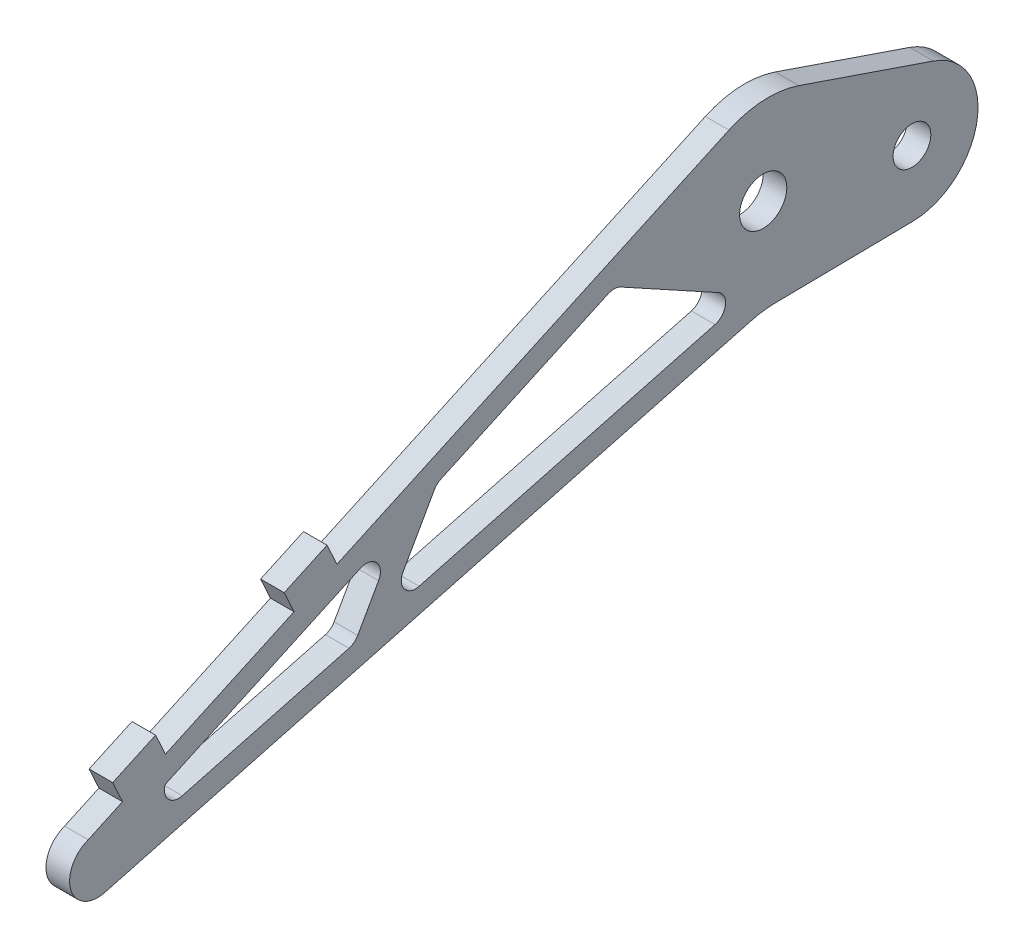
ISO-10303-21;
HEADER;
FILE_DESCRIPTION(('STEP AP214'),'2;1');
FILE_NAME('part.step','',(''),(''),'','','');
FILE_SCHEMA(('AUTOMOTIVE_DESIGN { 1 0 10303 214 1 1 1 1 }'));
ENDSEC;
DATA;
#1=APPLICATION_CONTEXT('core data for automotive mechanical design processes');
#2=APPLICATION_PROTOCOL_DEFINITION('international standard','automotive_design',2000,#1);
#3=PRODUCT_CONTEXT('',#1,'mechanical');
#4=PRODUCT('Part','Part','',(#3));
#5=PRODUCT_RELATED_PRODUCT_CATEGORY('part','',(#4));
#6=PRODUCT_DEFINITION_FORMATION('','',#4);
#7=PRODUCT_DEFINITION_CONTEXT('part definition',#1,'design');
#8=PRODUCT_DEFINITION('design','',#6,#7);
#9=PRODUCT_DEFINITION_SHAPE('','',#8);
#10=(LENGTH_UNIT() NAMED_UNIT(*) SI_UNIT(.MILLI.,.METRE.));
#11=(NAMED_UNIT(*) PLANE_ANGLE_UNIT() SI_UNIT($,.RADIAN.));
#12=(NAMED_UNIT(*) SI_UNIT($,.STERADIAN.) SOLID_ANGLE_UNIT());
#13=UNCERTAINTY_MEASURE_WITH_UNIT(LENGTH_MEASURE(1.E-05),#10,'distance_accuracy_value','');
#14=(GEOMETRIC_REPRESENTATION_CONTEXT(3) GLOBAL_UNCERTAINTY_ASSIGNED_CONTEXT((#13)) GLOBAL_UNIT_ASSIGNED_CONTEXT((#10,
#11,#12)) REPRESENTATION_CONTEXT('',''));
#15=CARTESIAN_POINT('',(0.,0.,0.));
#16=DIRECTION('',(0.,0.,1.));
#17=DIRECTION('',(1.,0.,0.));
#18=AXIS2_PLACEMENT_3D('',#15,#16,#17);
#19=CARTESIAN_POINT('',(-5.,42.7149862762416,75.7582726885151));
#20=DIRECTION('',(0.,-0.491142804434341,-0.871079069690215));
#21=DIRECTION('',(0.,0.871079069690215,-0.491142804434341));
#22=AXIS2_PLACEMENT_3D('',#19,#20,#21);
#23=PLANE('',#22);
#24=DIRECTION('',(0.,0.871079069690215,-0.491142804434341));
#25=VECTOR('',#24,1.);
#26=CARTESIAN_POINT('',(-5.,42.7149862762416,75.7582726885151));
#27=LINE('',#26,#25);
#28=CARTESIAN_POINT('',(-5.,-31.1814140846215,117.423474590042));
#29=VERTEX_POINT('',#28);
#30=CARTESIAN_POINT('',(-5.,-23.336162533829,113.00006576044));
#31=VERTEX_POINT('',#30);
#32=EDGE_CURVE('E325',#29,#31,#27,.T.);
#33=ORIENTED_EDGE('',*,*,#32,.F.);
#34=DIRECTION('',(1.,0.,0.));
#35=VECTOR('',#34,1.);
#36=CARTESIAN_POINT('',(0.,-31.1814140846215,117.423474590042));
#37=LINE('',#36,#35);
#38=CARTESIAN_POINT('',(0.,-31.1814140846215,117.423474590042));
#39=VERTEX_POINT('',#38);
#40=EDGE_CURVE('E434',#29,#39,#37,.T.);
#41=ORIENTED_EDGE('',*,*,#40,.T.);
#42=DIRECTION('',(0.,0.871079069690215,-0.491142804434341));
#43=VECTOR('',#42,1.);
#44=CARTESIAN_POINT('',(0.,42.7149862762416,75.7582726885151));
#45=LINE('',#44,#43);
#46=CARTESIAN_POINT('',(0.,-23.336162533829,113.00006576044));
#47=VERTEX_POINT('',#46);
#48=EDGE_CURVE('E383',#39,#47,#45,.T.);
#49=ORIENTED_EDGE('',*,*,#48,.T.);
#50=DIRECTION('',(1.,0.,0.));
#51=VECTOR('',#50,1.);
#52=CARTESIAN_POINT('',(-5.,-23.336162533829,113.00006576044));
#53=LINE('',#52,#51);
#54=EDGE_CURVE('E432',#47,#31,#53,.F.);
#55=ORIENTED_EDGE('',*,*,#54,.T.);
#56=EDGE_LOOP('',(#33,#41,#49,#55));
#57=FACE_BOUND('',#56,.T.);
#58=ADVANCED_FACE('F41',(#57),#23,.F.);
#59=CARTESIAN_POINT('',(-5.,28.5133908564941,13.0926520590053));
#60=DIRECTION('',(0.,0.908774699277071,0.417287126513471));
#61=DIRECTION('',(0.,-0.417287126513471,0.908774699277071));
#62=AXIS2_PLACEMENT_3D('',#59,#60,#61);
#63=PLANE('',#62);
#64=DIRECTION('',(0.,-0.417287126513471,0.908774699277071));
#65=VECTOR('',#64,1.);
#66=CARTESIAN_POINT('',(0.,28.5133908564941,13.0926520590053));
#67=LINE('',#66,#65);
#68=CARTESIAN_POINT('',(0.,-19.1364100226948,116.865164349051));
#69=VERTEX_POINT('',#68);
#70=CARTESIAN_POINT('',(0.,-37.8751570505175,157.674712770356));
#71=VERTEX_POINT('',#70);
#72=EDGE_CURVE('E274',#69,#71,#67,.T.);
#73=ORIENTED_EDGE('',*,*,#72,.T.);
#74=DIRECTION('',(1.,0.,0.));
#75=VECTOR('',#74,1.);
#76=CARTESIAN_POINT('',(-5.,-37.8751570505175,157.674712770356));
#77=LINE('',#76,#75);
#78=CARTESIAN_POINT('',(-5.,-37.8751570505175,157.674712770356));
#79=VERTEX_POINT('',#78);
#80=EDGE_CURVE('E429',#71,#79,#77,.F.);
#81=ORIENTED_EDGE('',*,*,#80,.T.);
#82=DIRECTION('',(0.,-0.417287126513471,0.908774699277071));
#83=VECTOR('',#82,1.);
#84=CARTESIAN_POINT('',(-5.,28.5133908564941,13.0926520590053));
#85=LINE('',#84,#83);
#86=CARTESIAN_POINT('',(-5.,-19.1364100226948,116.865164349051));
#87=VERTEX_POINT('',#86);
#88=EDGE_CURVE('E269',#87,#79,#85,.T.);
#89=ORIENTED_EDGE('',*,*,#88,.F.);
#90=DIRECTION('',(1.,0.,0.));
#91=VECTOR('',#90,1.);
#92=CARTESIAN_POINT('',(0.,-19.1364100226947,116.865164349051));
#93=LINE('',#92,#91);
#94=EDGE_CURVE('E426',#87,#69,#93,.T.);
#95=ORIENTED_EDGE('',*,*,#94,.T.);
#96=EDGE_LOOP('',(#73,#81,#89,#95));
#97=FACE_BOUND('',#96,.T.);
#98=ADVANCED_FACE('F495',(#97),#63,.F.);
#99=CARTESIAN_POINT('',(-5.,-22.2783526460679,12.2362606081096));
#100=DIRECTION('',(0.,0.876495415777774,-0.481410205667212));
#101=DIRECTION('',(0.,0.481410205667212,0.876495415777774));
#102=AXIS2_PLACEMENT_3D('',#99,#100,#101);
#103=PLANE('',#102);
#104=DIRECTION('',(0.,0.481410205667212,0.876495415777774));
#105=VECTOR('',#104,1.);
#106=CARTESIAN_POINT('',(-5.,-22.2783526460679,12.2362606081096));
#107=LINE('',#106,#105);
#108=CARTESIAN_POINT('',(-5.,-6.45483735528322,41.0458671569366));
#109=VERTEX_POINT('',#108);
#110=CARTESIAN_POINT('',(-5.,4.87295604040297,61.6701889210253));
#111=VERTEX_POINT('',#110);
#112=EDGE_CURVE('E313',#109,#111,#107,.T.);
#113=ORIENTED_EDGE('',*,*,#112,.F.);
#114=DIRECTION('',(1.,0.,0.));
#115=VECTOR('',#114,1.);
#116=CARTESIAN_POINT('',(0.,-6.45483735528322,41.0458671569366));
#117=LINE('',#116,#115);
#118=CARTESIAN_POINT('',(0.,-6.45483735528322,41.0458671569366));
#119=VERTEX_POINT('',#118);
#120=EDGE_CURVE('E458',#109,#119,#117,.T.);
#121=ORIENTED_EDGE('',*,*,#120,.T.);
#122=DIRECTION('',(0.,0.481410205667212,0.876495415777774));
#123=VECTOR('',#122,1.);
#124=CARTESIAN_POINT('',(0.,-22.2783526460679,12.2362606081096));
#125=LINE('',#124,#123);
#126=CARTESIAN_POINT('',(0.,4.87295604040297,61.6701889210253));
#127=VERTEX_POINT('',#126);
#128=EDGE_CURVE('E371',#119,#127,#125,.T.);
#129=ORIENTED_EDGE('',*,*,#128,.T.);
#130=DIRECTION('',(1.,0.,0.));
#131=VECTOR('',#130,1.);
#132=CARTESIAN_POINT('',(-5.,4.87295604040297,61.6701889210253));
#133=LINE('',#132,#131);
#134=EDGE_CURVE('E456',#127,#111,#133,.F.);
#135=ORIENTED_EDGE('',*,*,#134,.T.);
#136=EDGE_LOOP('',(#113,#121,#129,#135));
#137=FACE_BOUND('',#136,.T.);
#138=ADVANCED_FACE('F533',(#137),#103,.F.);
#139=CARTESIAN_POINT('',(-5.,28.5133908564941,13.0926520590053));
#140=DIRECTION('',(0.,0.908774699277071,0.417287126513471));
#141=DIRECTION('',(0.,-0.417287126513471,0.908774699277071));
#142=AXIS2_PLACEMENT_3D('',#139,#140,#141);
#143=PLANE('',#142);
#144=DIRECTION('',(0.,-0.417287126513471,0.908774699277071));
#145=VECTOR('',#144,1.);
#146=CARTESIAN_POINT('',(0.,28.5133908564941,13.0926520590053));
#147=LINE('',#146,#145);
#148=CARTESIAN_POINT('',(0.,4.96979389090087,64.3662809175674));
#149=VERTEX_POINT('',#148);
#150=CARTESIAN_POINT('',(0.,-11.3122815133787,99.8256498723704));
#151=VERTEX_POINT('',#150);
#152=EDGE_CURVE('E380',#149,#151,#147,.T.);
#153=ORIENTED_EDGE('',*,*,#152,.T.);
#154=DIRECTION('',(1.,0.,0.));
#155=VECTOR('',#154,1.);
#156=CARTESIAN_POINT('',(-5.,-11.3122815133787,99.8256498723704));
#157=LINE('',#156,#155);
#158=CARTESIAN_POINT('',(-5.,-11.3122815133787,99.8256498723704));
#159=VERTEX_POINT('',#158);
#160=EDGE_CURVE('E454',#151,#159,#157,.F.);
#161=ORIENTED_EDGE('',*,*,#160,.T.);
#162=DIRECTION('',(0.,-0.417287126513471,0.908774699277071));
#163=VECTOR('',#162,1.);
#164=CARTESIAN_POINT('',(-5.,28.5133908564941,13.0926520590053));
#165=LINE('',#164,#163);
#166=CARTESIAN_POINT('',(-5.,4.96979389090087,64.3662809175674));
#167=VERTEX_POINT('',#166);
#168=EDGE_CURVE('E322',#167,#159,#165,.T.);
#169=ORIENTED_EDGE('',*,*,#168,.F.);
#170=DIRECTION('',(1.,0.,0.));
#171=VECTOR('',#170,1.);
#172=CARTESIAN_POINT('',(0.,4.96979389090087,64.3662809175674));
#173=LINE('',#172,#171);
#174=EDGE_CURVE('E451',#167,#149,#173,.T.);
#175=ORIENTED_EDGE('',*,*,#174,.T.);
#176=EDGE_LOOP('',(#153,#161,#169,#175));
#177=FACE_BOUND('',#176,.T.);
#178=ADVANCED_FACE('F537',(#177),#143,.F.);
#179=CARTESIAN_POINT('',(-5.,40.2592722540699,71.402877340064));
#180=DIRECTION('',(0.,0.491142804434341,0.871079069690215));
#181=DIRECTION('',(0.,-0.871079069690215,0.491142804434341));
#182=AXIS2_PLACEMENT_3D('',#179,#180,#181);
#183=PLANE('',#182);
#184=DIRECTION('',(0.,-0.871079069690215,0.491142804434341));
#185=VECTOR('',#184,1.);
#186=CARTESIAN_POINT('',(0.,40.2592722540699,71.402877340064));
#187=LINE('',#186,#185);
#188=CARTESIAN_POINT('',(0.,-12.5651771979069,101.187025701901));
#189=VERTEX_POINT('',#188);
#190=CARTESIAN_POINT('',(0.,-24.283668901225,107.794293720584));
#191=VERTEX_POINT('',#190);
#192=EDGE_CURVE('E377',#189,#191,#187,.T.);
#193=ORIENTED_EDGE('',*,*,#192,.T.);
#194=DIRECTION('',(1.,0.,0.));
#195=VECTOR('',#194,1.);
#196=CARTESIAN_POINT('',(-5.,-24.283668901225,107.794293720584));
#197=LINE('',#196,#195);
#198=CARTESIAN_POINT('',(-5.,-24.283668901225,107.794293720584));
#199=VERTEX_POINT('',#198);
#200=EDGE_CURVE('E449',#191,#199,#197,.F.);
#201=ORIENTED_EDGE('',*,*,#200,.T.);
#202=DIRECTION('',(0.,-0.871079069690215,0.491142804434341));
#203=VECTOR('',#202,1.);
#204=CARTESIAN_POINT('',(-5.,40.2592722540699,71.402877340064));
#205=LINE('',#204,#203);
#206=CARTESIAN_POINT('',(-5.,-12.5651771979069,101.187025701901));
#207=VERTEX_POINT('',#206);
#208=EDGE_CURVE('E319',#207,#199,#205,.T.);
#209=ORIENTED_EDGE('',*,*,#208,.F.);
#210=DIRECTION('',(1.,0.,0.));
#211=VECTOR('',#210,1.);
#212=CARTESIAN_POINT('',(0.,-12.5651771979069,101.187025701901));
#213=LINE('',#212,#211);
#214=EDGE_CURVE('E446',#207,#189,#213,.T.);
#215=ORIENTED_EDGE('',*,*,#214,.T.);
#216=EDGE_LOOP('',(#193,#201,#209,#215));
#217=FACE_BOUND('',#216,.T.);
#218=ADVANCED_FACE('F540',(#217),#183,.F.);
#219=CARTESIAN_POINT('',(-5.,-45.7462798135083,172.467741214277));
#220=DIRECTION('',(1.,0.,0.));
#221=DIRECTION('',(0.,0.,-1.));
#222=AXIS2_PLACEMENT_3D('',#219,#220,#221);
#223=CYLINDRICAL_SURFACE('',#222,6.);
#224=CARTESIAN_POINT('',(0.,-45.7462798135083,172.467741214277));
#225=DIRECTION('',(1.,0.,0.));
#226=DIRECTION('',(0.,0.,-1.));
#227=AXIS2_PLACEMENT_3D('',#224,#225,#226);
#228=CIRCLE('',#227,6.);
#229=CARTESIAN_POINT('',(0.,-51.3844355382237,170.415620354323));
#230=VERTEX_POINT('',#229);
#231=CARTESIAN_POINT('',(0.,-40.1081240887928,174.519862074231));
#232=VERTEX_POINT('',#231);
#233=EDGE_CURVE('E332',#230,#232,#228,.F.);
#234=ORIENTED_EDGE('',*,*,#233,.T.);
#235=DIRECTION('',(1.,0.,0.));
#236=VECTOR('',#235,1.);
#237=CARTESIAN_POINT('',(-5.,-40.1081240887928,174.519862074231));
#238=LINE('',#237,#236);
#239=CARTESIAN_POINT('',(-5.,-40.1081240887928,174.519862074231));
#240=VERTEX_POINT('',#239);
#241=EDGE_CURVE('E273',#240,#232,#238,.T.);
#242=ORIENTED_EDGE('',*,*,#241,.F.);
#243=CARTESIAN_POINT('',(-5.,-45.7462798135083,172.467741214277));
#244=DIRECTION('',(1.,0.,0.));
#245=DIRECTION('',(0.,0.,-1.));
#246=AXIS2_PLACEMENT_3D('',#243,#244,#245);
#247=CIRCLE('',#246,6.);
#248=CARTESIAN_POINT('',(-5.,-51.3844355382237,170.415620354323));
#249=VERTEX_POINT('',#248);
#250=EDGE_CURVE('E250',#249,#240,#247,.F.);
#251=ORIENTED_EDGE('',*,*,#250,.F.);
#252=DIRECTION('',(1.,0.,0.));
#253=VECTOR('',#252,1.);
#254=CARTESIAN_POINT('',(-5.,-51.3844355382237,170.415620354323));
#255=LINE('',#254,#253);
#256=EDGE_CURVE('E261',#249,#230,#255,.T.);
#257=ORIENTED_EDGE('',*,*,#256,.T.);
#258=EDGE_LOOP('',(#234,#242,#251,#257));
#259=FACE_BOUND('',#258,.T.);
#260=ADVANCED_FACE('F271',(#259),#223,.T.);
#261=CARTESIAN_POINT('',(-5.,33.0572643528795,15.1790876915727));
#262=DIRECTION('',(0.,-0.908774699277071,-0.417287126513471));
#263=DIRECTION('',(0.,0.417287126513471,-0.908774699277071));
#264=AXIS2_PLACEMENT_3D('',#261,#262,#263);
#265=PLANE('',#264);
#266=DIRECTION('',(0.,0.417287126513471,-0.908774699277071));
#267=VECTOR('',#266,1.);
#268=CARTESIAN_POINT('',(0.,33.0572643528795,15.1790876915727));
#269=LINE('',#268,#267);
#270=CARTESIAN_POINT('',(0.,-36.769827076685,167.249664480015));
#271=VERTEX_POINT('',#270);
#272=EDGE_CURVE('E348',#232,#271,#269,.T.);
#273=ORIENTED_EDGE('',*,*,#272,.T.);
#274=DIRECTION('',(1.,0.,0.));
#275=VECTOR('',#274,1.);
#276=CARTESIAN_POINT('',(-5.,-36.769827076685,167.249664480015));
#277=LINE('',#276,#275);
#278=CARTESIAN_POINT('',(-5.,-36.769827076685,167.249664480015));
#279=VERTEX_POINT('',#278);
#280=EDGE_CURVE('E390',#279,#271,#277,.T.);
#281=ORIENTED_EDGE('',*,*,#280,.F.);
#282=DIRECTION('',(0.,0.417287126513471,-0.908774699277071));
#283=VECTOR('',#282,1.);
#284=CARTESIAN_POINT('',(-5.,33.0572643528795,15.1790876915727));
#285=LINE('',#284,#283);
#286=EDGE_CURVE('E290',#240,#279,#285,.T.);
#287=ORIENTED_EDGE('',*,*,#286,.F.);
#288=ORIENTED_EDGE('',*,*,#241,.T.);
#289=EDGE_LOOP('',(#273,#281,#287,#288));
#290=FACE_BOUND('',#289,.T.);
#291=ADVANCED_FACE('F561',(#290),#265,.F.);
#292=CARTESIAN_POINT('',(-5.,-69.8270914295631,152.070576788443));
#293=DIRECTION('',(0.,-0.417287126513462,0.908774699277075));
#294=DIRECTION('',(0.,-0.908774699277075,-0.417287126513462));
#295=AXIS2_PLACEMENT_3D('',#292,#293,#294);
#296=PLANE('',#295);
#297=DIRECTION('',(0.,-0.908774699277075,-0.417287126513462));
#298=VECTOR('',#297,1.);
#299=CARTESIAN_POINT('',(0.,-69.8270914295631,152.070576788443));
#300=LINE('',#299,#298);
#301=CARTESIAN_POINT('',(0.,-32.2259535802997,169.336100112582));
#302=VERTEX_POINT('',#301);
#303=EDGE_CURVE('E362',#302,#271,#300,.T.);
#304=ORIENTED_EDGE('',*,*,#303,.F.);
#305=DIRECTION('',(1.,0.,0.));
#306=VECTOR('',#305,1.);
#307=CARTESIAN_POINT('',(-5.,-32.2259535802997,169.336100112582));
#308=LINE('',#307,#306);
#309=CARTESIAN_POINT('',(-5.,-32.2259535802997,169.336100112582));
#310=VERTEX_POINT('',#309);
#311=EDGE_CURVE('E392',#310,#302,#308,.T.);
#312=ORIENTED_EDGE('',*,*,#311,.F.);
#313=DIRECTION('',(0.,-0.908774699277075,-0.417287126513462));
#314=VECTOR('',#313,1.);
#315=CARTESIAN_POINT('',(-5.,-69.8270914295631,152.070576788443));
#316=LINE('',#315,#314);
#317=EDGE_CURVE('E304',#310,#279,#316,.T.);
#318=ORIENTED_EDGE('',*,*,#317,.T.);
#319=ORIENTED_EDGE('',*,*,#280,.T.);
#320=EDGE_LOOP('',(#304,#312,#318,#319));
#321=FACE_BOUND('',#320,.T.);
#322=ADVANCED_FACE('F564',(#321),#296,.T.);
#323=CARTESIAN_POINT('',(-5.,37.6011378492649,17.2655233241401));
#324=DIRECTION('',(0.,0.90877469927707,0.417287126513472));
#325=DIRECTION('',(0.,-0.417287126513472,0.90877469927707));
#326=AXIS2_PLACEMENT_3D('',#323,#324,#325);
#327=PLANE('',#326);
#328=DIRECTION('',(0.,-0.417287126513472,0.90877469927707));
#329=VECTOR('',#328,1.);
#330=CARTESIAN_POINT('',(0.,37.6011378492649,17.2655233241401));
#331=LINE('',#330,#329);
#332=CARTESIAN_POINT('',(0.,-28.053082315165,160.248353119811));
#333=VERTEX_POINT('',#332);
#334=EDGE_CURVE('E359',#333,#302,#331,.T.);
#335=ORIENTED_EDGE('',*,*,#334,.F.);
#336=DIRECTION('',(1.,0.,0.));
#337=VECTOR('',#336,1.);
#338=CARTESIAN_POINT('',(-5.,-28.053082315165,160.248353119811));
#339=LINE('',#338,#337);
#340=CARTESIAN_POINT('',(-5.,-28.053082315165,160.248353119811));
#341=VERTEX_POINT('',#340);
#342=EDGE_CURVE('E394',#341,#333,#339,.T.);
#343=ORIENTED_EDGE('',*,*,#342,.F.);
#344=DIRECTION('',(0.,-0.417287126513472,0.90877469927707));
#345=VECTOR('',#344,1.);
#346=CARTESIAN_POINT('',(-5.,37.6011378492649,17.2655233241401));
#347=LINE('',#346,#345);
#348=EDGE_CURVE('E301',#341,#310,#347,.T.);
#349=ORIENTED_EDGE('',*,*,#348,.T.);
#350=ORIENTED_EDGE('',*,*,#311,.T.);
#351=EDGE_LOOP('',(#335,#343,#349,#350));
#352=FACE_BOUND('',#351,.T.);
#353=ADVANCED_FACE('F570',(#352),#327,.T.);
#354=CARTESIAN_POINT('',(-5.,-65.6542201644277,142.982829795673));
#355=DIRECTION('',(0.,-0.417287126513456,0.908774699277078));
#356=DIRECTION('',(0.,-0.908774699277078,-0.417287126513456));
#357=AXIS2_PLACEMENT_3D('',#354,#355,#356);
#358=PLANE('',#357);
#359=DIRECTION('',(0.,-0.908774699277078,-0.417287126513456));
#360=VECTOR('',#359,1.);
#361=CARTESIAN_POINT('',(0.,-65.6542201644277,142.982829795673));
#362=LINE('',#361,#360);
#363=CARTESIAN_POINT('',(0.,-32.5969558115504,158.161917487244));
#364=VERTEX_POINT('',#363);
#365=EDGE_CURVE('E357',#333,#364,#362,.T.);
#366=ORIENTED_EDGE('',*,*,#365,.T.);
#367=DIRECTION('',(1.,0.,0.));
#368=VECTOR('',#367,1.);
#369=CARTESIAN_POINT('',(-5.,-32.5969558115504,158.161917487244));
#370=LINE('',#369,#368);
#371=CARTESIAN_POINT('',(-5.,-32.5969558115504,158.161917487244));
#372=VERTEX_POINT('',#371);
#373=EDGE_CURVE('E396',#372,#364,#370,.T.);
#374=ORIENTED_EDGE('',*,*,#373,.F.);
#375=DIRECTION('',(0.,-0.908774699277078,-0.417287126513456));
#376=VECTOR('',#375,1.);
#377=CARTESIAN_POINT('',(-5.,-65.6542201644277,142.982829795673));
#378=LINE('',#377,#376);
#379=EDGE_CURVE('E299',#341,#372,#378,.T.);
#380=ORIENTED_EDGE('',*,*,#379,.F.);
#381=ORIENTED_EDGE('',*,*,#342,.T.);
#382=EDGE_LOOP('',(#366,#374,#380,#381));
#383=FACE_BOUND('',#382,.T.);
#384=ADVANCED_FACE('F574',(#383),#358,.F.);
#385=CARTESIAN_POINT('',(0.,-20.0863155732595,130.916041451455));
#386=VERTEX_POINT('',#385);
#387=EDGE_CURVE('E349',#364,#386,#269,.T.);
#388=ORIENTED_EDGE('',*,*,#387,.T.);
#389=DIRECTION('',(1.,0.,0.));
#390=VECTOR('',#389,1.);
#391=CARTESIAN_POINT('',(-5.,-20.0863155732595,130.916041451455));
#392=LINE('',#391,#390);
#393=CARTESIAN_POINT('',(-5.,-20.0863155732595,130.916041451455));
#394=VERTEX_POINT('',#393);
#395=EDGE_CURVE('E399',#394,#386,#392,.T.);
#396=ORIENTED_EDGE('',*,*,#395,.F.);
#397=EDGE_CURVE('E291',#372,#394,#285,.T.);
#398=ORIENTED_EDGE('',*,*,#397,.F.);
#399=ORIENTED_EDGE('',*,*,#373,.T.);
#400=EDGE_LOOP('',(#388,#396,#398,#399));
#401=FACE_BOUND('',#400,.T.);
#402=ADVANCED_FACE('F567',(#401),#265,.F.);
#403=CARTESIAN_POINT('',(-5.,-53.1435799261391,115.736953759883));
#404=DIRECTION('',(0.,-0.417287126513472,0.90877469927707));
#405=DIRECTION('',(0.,-0.90877469927707,-0.417287126513472));
#406=AXIS2_PLACEMENT_3D('',#403,#404,#405);
#407=PLANE('',#406);
#408=DIRECTION('',(0.,-0.90877469927707,-0.417287126513472));
#409=VECTOR('',#408,1.);
#410=CARTESIAN_POINT('',(0.,-53.1435799261391,115.736953759883));
#411=LINE('',#410,#409);
#412=CARTESIAN_POINT('',(0.,-15.5424752580719,133.002461848028));
#413=VERTEX_POINT('',#412);
#414=EDGE_CURVE('E354',#413,#386,#411,.T.);
#415=ORIENTED_EDGE('',*,*,#414,.F.);
#416=DIRECTION('',(1.,0.,0.));
#417=VECTOR('',#416,1.);
#418=CARTESIAN_POINT('',(-5.,-15.5424752580719,133.002461848028));
#419=LINE('',#418,#417);
#420=CARTESIAN_POINT('',(-5.,-15.5424752580719,133.002461848028));
#421=VERTEX_POINT('',#420);
#422=EDGE_CURVE('E401',#421,#413,#419,.T.);
#423=ORIENTED_EDGE('',*,*,#422,.F.);
#424=DIRECTION('',(0.,-0.90877469927707,-0.417287126513472));
#425=VECTOR('',#424,1.);
#426=CARTESIAN_POINT('',(-5.,-53.1435799261391,115.736953759883));
#427=LINE('',#426,#425);
#428=EDGE_CURVE('E296',#421,#394,#427,.T.);
#429=ORIENTED_EDGE('',*,*,#428,.T.);
#430=ORIENTED_EDGE('',*,*,#395,.T.);
#431=EDGE_LOOP('',(#415,#423,#429,#430));
#432=FACE_BOUND('',#431,.T.);
#433=ADVANCED_FACE('F579',(#432),#407,.T.);
#434=CARTESIAN_POINT('',(-5.,37.6011046680671,17.2655080881452));
#435=DIRECTION('',(0.,0.90877469927707,0.417287126513472));
#436=DIRECTION('',(0.,-0.417287126513472,0.908774699277071));
#437=AXIS2_PLACEMENT_3D('',#434,#435,#436);
#438=PLANE('',#437);
#439=DIRECTION('',(0.,-0.417287126513472,0.908774699277071));
#440=VECTOR('',#439,1.);
#441=CARTESIAN_POINT('',(0.,37.6011046680671,17.2655080881452));
#442=LINE('',#441,#440);
#443=CARTESIAN_POINT('',(0.,-11.3696039929372,123.914714855257));
#444=VERTEX_POINT('',#443);
#445=EDGE_CURVE('E351',#444,#413,#442,.T.);
#446=ORIENTED_EDGE('',*,*,#445,.F.);
#447=DIRECTION('',(1.,0.,0.));
#448=VECTOR('',#447,1.);
#449=CARTESIAN_POINT('',(-5.,-11.3696039929372,123.914714855257));
#450=LINE('',#449,#448);
#451=CARTESIAN_POINT('',(-5.,-11.3696039929372,123.914714855257));
#452=VERTEX_POINT('',#451);
#453=EDGE_CURVE('E403',#452,#444,#450,.T.);
#454=ORIENTED_EDGE('',*,*,#453,.F.);
#455=DIRECTION('',(0.,-0.417287126513472,0.908774699277071));
#456=VECTOR('',#455,1.);
#457=CARTESIAN_POINT('',(-5.,37.6011046680671,17.2655080881452));
#458=LINE('',#457,#456);
#459=EDGE_CURVE('E293',#452,#421,#458,.T.);
#460=ORIENTED_EDGE('',*,*,#459,.T.);
#461=ORIENTED_EDGE('',*,*,#422,.T.);
#462=EDGE_LOOP('',(#446,#454,#460,#461));
#463=FACE_BOUND('',#462,.T.);
#464=ADVANCED_FACE('F582',(#463),#438,.T.);
#465=CARTESIAN_POINT('',(-5.,-48.9707086610044,106.649206767112));
#466=DIRECTION('',(0.,-0.417287126513472,0.90877469927707));
#467=DIRECTION('',(0.,-0.90877469927707,-0.417287126513472));
#468=AXIS2_PLACEMENT_3D('',#465,#466,#467);
#469=PLANE('',#468);
#470=DIRECTION('',(0.,-0.90877469927707,-0.417287126513472));
#471=VECTOR('',#470,1.);
#472=CARTESIAN_POINT('',(0.,-48.9707086610044,106.649206767112));
#473=LINE('',#472,#471);
#474=CARTESIAN_POINT('',(0.,-15.9134443081248,121.828294458685));
#475=VERTEX_POINT('',#474);
#476=EDGE_CURVE('E347',#444,#475,#473,.T.);
#477=ORIENTED_EDGE('',*,*,#476,.T.);
#478=DIRECTION('',(1.,0.,0.));
#479=VECTOR('',#478,1.);
#480=CARTESIAN_POINT('',(-5.,-15.9134443081248,121.828294458685));
#481=LINE('',#480,#479);
#482=CARTESIAN_POINT('',(-5.,-15.9134443081248,121.828294458685));
#483=VERTEX_POINT('',#482);
#484=EDGE_CURVE('E405',#483,#475,#481,.T.);
#485=ORIENTED_EDGE('',*,*,#484,.F.);
#486=DIRECTION('',(0.,-0.90877469927707,-0.417287126513472));
#487=VECTOR('',#486,1.);
#488=CARTESIAN_POINT('',(-5.,-48.9707086610044,106.649206767112));
#489=LINE('',#488,#487);
#490=EDGE_CURVE('E289',#452,#483,#489,.T.);
#491=ORIENTED_EDGE('',*,*,#490,.F.);
#492=ORIENTED_EDGE('',*,*,#453,.T.);
#493=EDGE_LOOP('',(#477,#485,#491,#492));
#494=FACE_BOUND('',#493,.T.);
#495=ADVANCED_FACE('F586',(#494),#469,.F.);
#496=CARTESIAN_POINT('',(0.,22.2254590824953,38.7687695958942));
#497=VERTEX_POINT('',#496);
#498=EDGE_CURVE('E344',#475,#497,#269,.T.);
#499=ORIENTED_EDGE('',*,*,#498,.T.);
#500=DIRECTION('',(1.,0.,0.));
#501=VECTOR('',#500,1.);
#502=CARTESIAN_POINT('',(-5.,22.2254590824953,38.7687695958942));
#503=LINE('',#502,#501);
#504=CARTESIAN_POINT('',(-5.,22.2254590824953,38.7687695958942));
#505=VERTEX_POINT('',#504);
#506=EDGE_CURVE('E419',#497,#505,#503,.F.);
#507=ORIENTED_EDGE('',*,*,#506,.T.);
#508=EDGE_CURVE('E287',#483,#505,#285,.T.);
#509=ORIENTED_EDGE('',*,*,#508,.F.);
#510=ORIENTED_EDGE('',*,*,#484,.T.);
#511=EDGE_LOOP('',(#499,#507,#509,#510));
#512=FACE_BOUND('',#511,.T.);
#513=ADVANCED_FACE('F566',(#512),#265,.F.);
#514=CARTESIAN_POINT('',(-5.,13.2486470056288,-4.52474889029694));
#515=DIRECTION('',(0.,0.946331928973485,-0.323196349306925));
#516=DIRECTION('',(0.,0.323196349306925,0.946331928973485));
#517=AXIS2_PLACEMENT_3D('',#514,#515,#516);
#518=PLANE('',#517);
#519=DIRECTION('',(0.,0.323196349306925,0.946331928973485));
#520=VECTOR('',#519,1.);
#521=CARTESIAN_POINT('',(-5.,13.2486470056288,-4.52474889029694));
#522=LINE('',#521,#520);
#523=CARTESIAN_POINT('',(-5.,13.2486470056288,-4.52474889029694));
#524=VERTEX_POINT('',#523);
#525=CARTESIAN_POINT('',(-5.,22.9766036764236,23.9591000794863));
#526=VERTEX_POINT('',#525);
#527=EDGE_CURVE('E284',#524,#526,#522,.T.);
#528=ORIENTED_EDGE('',*,*,#527,.T.);
#529=DIRECTION('',(1.,0.,0.));
#530=VECTOR('',#529,1.);
#531=CARTESIAN_POINT('',(0.,22.9766036764236,23.9591000794863));
#532=LINE('',#531,#530);
#533=CARTESIAN_POINT('',(0.,22.9766036764236,23.9591000794863));
#534=VERTEX_POINT('',#533);
#535=EDGE_CURVE('E414',#526,#534,#532,.T.);
#536=ORIENTED_EDGE('',*,*,#535,.T.);
#537=DIRECTION('',(0.,0.323196349306925,0.946331928973485));
#538=VECTOR('',#537,1.);
#539=CARTESIAN_POINT('',(0.,13.2486470056288,-4.52474889029694));
#540=LINE('',#539,#538);
#541=CARTESIAN_POINT('',(0.,13.2486470056288,-4.52474889029694));
#542=VERTEX_POINT('',#541);
#543=EDGE_CURVE('E341',#542,#534,#540,.T.);
#544=ORIENTED_EDGE('',*,*,#543,.F.);
#545=DIRECTION('',(1.,0.,0.));
#546=VECTOR('',#545,1.);
#547=CARTESIAN_POINT('',(-5.,13.2486470056288,-4.52474889029694));
#548=LINE('',#547,#546);
#549=EDGE_CURVE('E408',#524,#542,#548,.T.);
#550=ORIENTED_EDGE('',*,*,#549,.F.);
#551=EDGE_LOOP('',(#528,#536,#544,#550));
#552=FACE_BOUND('',#551,.T.);
#553=ADVANCED_FACE('F591',(#552),#518,.T.);
#554=CARTESIAN_POINT('',(-5.,0.,0.));
#555=DIRECTION('',(1.,0.,0.));
#556=DIRECTION('',(0.,0.,-1.));
#557=AXIS2_PLACEMENT_3D('',#554,#555,#556);
#558=CYLINDRICAL_SURFACE('',#557,14.);
#559=CARTESIAN_POINT('',(0.,0.,0.));
#560=DIRECTION('',(1.,0.,0.));
#561=DIRECTION('',(0.,0.,-1.));
#562=AXIS2_PLACEMENT_3D('',#559,#560,#561);
#563=CIRCLE('',#562,14.);
#564=CARTESIAN_POINT('',(0.,-13.9986239191652,-0.196286448273089));
#565=VERTEX_POINT('',#564);
#566=EDGE_CURVE('E338',#565,#542,#563,.T.);
#567=ORIENTED_EDGE('',*,*,#566,.F.);
#568=DIRECTION('',(1.,0.,0.));
#569=VECTOR('',#568,1.);
#570=CARTESIAN_POINT('',(-5.,-13.9986239191652,-0.196286448273089));
#571=LINE('',#570,#569);
#572=CARTESIAN_POINT('',(-5.,-13.9986239191652,-0.196286448273089));
#573=VERTEX_POINT('',#572);
#574=EDGE_CURVE('E268',#573,#565,#571,.T.);
#575=ORIENTED_EDGE('',*,*,#574,.F.);
#576=CARTESIAN_POINT('',(-5.,0.,0.));
#577=DIRECTION('',(1.,0.,0.));
#578=DIRECTION('',(0.,0.,-1.));
#579=AXIS2_PLACEMENT_3D('',#576,#577,#578);
#580=CIRCLE('',#579,14.);
#581=EDGE_CURVE('E281',#573,#524,#580,.T.);
#582=ORIENTED_EDGE('',*,*,#581,.T.);
#583=ORIENTED_EDGE('',*,*,#549,.T.);
#584=EDGE_LOOP('',(#567,#575,#582,#583));
#585=FACE_BOUND('',#584,.T.);
#586=ADVANCED_FACE('F594',(#585),#558,.T.);
#587=CARTESIAN_POINT('',(-5.,-13.9986239191652,-0.196286448273089));
#588=DIRECTION('',(0.,0.999901708511801,0.0140204605909349));
#589=DIRECTION('',(0.,-0.0140204605909349,0.999901708511801));
#590=AXIS2_PLACEMENT_3D('',#587,#588,#589);
#591=PLANE('',#590);
#592=DIRECTION('',(0.,-0.014020460590935,0.999901708511801));
#593=VECTOR('',#592,1.);
#594=CARTESIAN_POINT('',(0.,-13.9986239191652,-0.196286448273089));
#595=LINE('',#594,#593);
#596=CARTESIAN_POINT('',(0.,-14.4086052363864,29.0424833402508));
#597=VERTEX_POINT('',#596);
#598=EDGE_CURVE('E335',#565,#597,#595,.T.);
#599=ORIENTED_EDGE('',*,*,#598,.T.);
#600=DIRECTION('',(1.,0.,0.));
#601=VECTOR('',#600,1.);
#602=CARTESIAN_POINT('',(-5.,-14.4086052363864,29.0424833402508));
#603=LINE('',#602,#601);
#604=CARTESIAN_POINT('',(-5.,-14.4086052363864,29.0424833402508));
#605=VERTEX_POINT('',#604);
#606=EDGE_CURVE('E412',#597,#605,#603,.F.);
#607=ORIENTED_EDGE('',*,*,#606,.T.);
#608=DIRECTION('',(0.,-0.014020460590935,0.999901708511801));
#609=VECTOR('',#608,1.);
#610=CARTESIAN_POINT('',(-5.,-13.9986239191652,-0.196286448273089));
#611=LINE('',#610,#609);
#612=EDGE_CURVE('E258',#573,#605,#611,.T.);
#613=ORIENTED_EDGE('',*,*,#612,.F.);
#614=ORIENTED_EDGE('',*,*,#574,.T.);
#615=EDGE_LOOP('',(#599,#607,#613,#614));
#616=FACE_BOUND('',#615,.T.);
#617=ADVANCED_FACE('F549',(#616),#591,.F.);
#618=CARTESIAN_POINT('',(-5.,-0.82960980157538,-0.220636225213123));
#619=DIRECTION('',(0.,-0.966406719164595,-0.257017612535645));
#620=DIRECTION('',(0.,0.257017612535645,-0.966406719164595));
#621=AXIS2_PLACEMENT_3D('',#618,#619,#620);
#622=PLANE('',#621);
#623=DIRECTION('',(0.,0.257017612535645,-0.966406719164595));
#624=VECTOR('',#623,1.);
#625=CARTESIAN_POINT('',(-5.,-0.82960980157538,-0.220636225213123));
#626=LINE('',#625,#624);
#627=CARTESIAN_POINT('',(-5.,-28.6563174720218,104.410003673906));
#628=VERTEX_POINT('',#627);
#629=CARTESIAN_POINT('',(-5.,-11.9835437601103,41.7190449363313));
#630=VERTEX_POINT('',#629);
#631=EDGE_CURVE('E316',#628,#630,#626,.T.);
#632=ORIENTED_EDGE('',*,*,#631,.F.);
#633=DIRECTION('',(1.,0.,0.));
#634=VECTOR('',#633,1.);
#635=CARTESIAN_POINT('',(0.,-28.6563174720218,104.410003673906));
#636=LINE('',#635,#634);
#637=CARTESIAN_POINT('',(0.,-28.6563174720218,104.410003673906));
#638=VERTEX_POINT('',#637);
#639=EDGE_CURVE('E443',#628,#638,#636,.T.);
#640=ORIENTED_EDGE('',*,*,#639,.T.);
#641=DIRECTION('',(0.,0.257017612535645,-0.966406719164595));
#642=VECTOR('',#641,1.);
#643=CARTESIAN_POINT('',(0.,-0.82960980157538,-0.220636225213123));
#644=LINE('',#643,#642);
#645=CARTESIAN_POINT('',(0.,-11.9835437601103,41.7190449363313));
#646=VERTEX_POINT('',#645);
#647=EDGE_CURVE('E374',#638,#646,#644,.T.);
#648=ORIENTED_EDGE('',*,*,#647,.T.);
#649=DIRECTION('',(1.,0.,0.));
#650=VECTOR('',#649,1.);
#651=CARTESIAN_POINT('',(-5.,-11.9835437601103,41.7190449363313));
#652=LINE('',#651,#650);
#653=EDGE_CURVE('E441',#646,#630,#652,.F.);
#654=ORIENTED_EDGE('',*,*,#653,.T.);
#655=EDGE_LOOP('',(#632,#640,#648,#654));
#656=FACE_BOUND('',#655,.T.);
#657=ADVANCED_FACE('F545',(#656),#622,.F.);
#658=CARTESIAN_POINT('',(-5.,0.,0.));
#659=DIRECTION('',(1.,0.,0.));
#660=DIRECTION('',(0.,0.,-1.));
#661=AXIS2_PLACEMENT_3D('',#658,#659,#660);
#662=CYLINDRICAL_SURFACE('',#661,4.);
#663=CARTESIAN_POINT('',(-5.,0.,0.));
#664=DIRECTION('',(1.,0.,0.));
#665=DIRECTION('',(0.,0.,-1.));
#666=AXIS2_PLACEMENT_3D('',#663,#664,#665);
#667=CIRCLE('',#666,4.);
#668=CARTESIAN_POINT('',(-5.,0.,-4.));
#669=VERTEX_POINT('',#668);
#670=EDGE_CURVE('E310',#669,#669,#667,.T.);
#671=ORIENTED_EDGE('',*,*,#670,.F.);
#672=EDGE_LOOP('',(#671));
#673=FACE_BOUND('',#672,.T.);
#674=CARTESIAN_POINT('',(0.,0.,0.));
#675=DIRECTION('',(1.,0.,0.));
#676=DIRECTION('',(0.,0.,-1.));
#677=AXIS2_PLACEMENT_3D('',#674,#675,#676);
#678=CIRCLE('',#677,4.);
#679=CARTESIAN_POINT('',(0.,0.,-4.));
#680=VERTEX_POINT('',#679);
#681=EDGE_CURVE('E368',#680,#680,#678,.T.);
#682=ORIENTED_EDGE('',*,*,#681,.T.);
#683=EDGE_LOOP('',(#682));
#684=FACE_BOUND('',#683,.T.);
#685=ADVANCED_FACE('F548',(#673,#684),#662,.F.);
#686=CARTESIAN_POINT('',(-5.,5.55674168534165,31.5138480963907));
#687=DIRECTION('',(1.,0.,0.));
#688=DIRECTION('',(0.,0.,-1.));
#689=AXIS2_PLACEMENT_3D('',#686,#687,#688);
#690=CYLINDRICAL_SURFACE('',#689,5.);
#691=CARTESIAN_POINT('',(-5.,5.55674168534165,31.5138480963907));
#692=DIRECTION('',(1.,0.,0.));
#693=DIRECTION('',(0.,0.,-1.));
#694=AXIS2_PLACEMENT_3D('',#691,#692,#693);
#695=CIRCLE('',#694,5.);
#696=CARTESIAN_POINT('',(-5.,5.55674168534165,26.5138480963907));
#697=VERTEX_POINT('',#696);
#698=EDGE_CURVE('E307',#697,#697,#695,.T.);
#699=ORIENTED_EDGE('',*,*,#698,.F.);
#700=EDGE_LOOP('',(#699));
#701=FACE_BOUND('',#700,.T.);
#702=CARTESIAN_POINT('',(0.,5.55674168534165,31.5138480963907));
#703=DIRECTION('',(1.,0.,0.));
#704=DIRECTION('',(0.,0.,-1.));
#705=AXIS2_PLACEMENT_3D('',#702,#703,#704);
#706=CIRCLE('',#705,5.);
#707=CARTESIAN_POINT('',(0.,5.55674168534165,26.5138480963907));
#708=VERTEX_POINT('',#707);
#709=EDGE_CURVE('E365',#708,#708,#706,.T.);
#710=ORIENTED_EDGE('',*,*,#709,.T.);
#711=EDGE_LOOP('',(#710));
#712=FACE_BOUND('',#711,.T.);
#713=ADVANCED_FACE('F556',(#701,#712),#690,.F.);
#714=CARTESIAN_POINT('',(-5.,-5.66164339739837,-1.50572428789135));
#715=DIRECTION('',(0.,0.966406719164595,0.257017612535645));
#716=DIRECTION('',(0.,-0.257017612535645,0.966406719164595));
#717=AXIS2_PLACEMENT_3D('',#714,#715,#716);
#718=PLANE('',#717);
#719=DIRECTION('',(0.,-0.257017612535645,0.966406719164595));
#720=VECTOR('',#719,1.);
#721=CARTESIAN_POINT('',(-5.,-5.66164339739837,-1.50572428789135));
#722=LINE('',#721,#720);
#723=CARTESIAN_POINT('',(-5.,-15.0785050233305,33.902426379145));
#724=VERTEX_POINT('',#723);
#725=EDGE_CURVE('E244',#724,#249,#722,.T.);
#726=ORIENTED_EDGE('',*,*,#725,.F.);
#727=DIRECTION('',(1.,0.,0.));
#728=VECTOR('',#727,1.);
#729=CARTESIAN_POINT('',(0.,-15.0785050233305,33.902426379145));
#730=LINE('',#729,#728);
#731=CARTESIAN_POINT('',(0.,-15.0785050233305,33.902426379145));
#732=VERTEX_POINT('',#731);
#733=EDGE_CURVE('E389',#724,#732,#730,.T.);
#734=ORIENTED_EDGE('',*,*,#733,.T.);
#735=DIRECTION('',(0.,-0.257017612535645,0.966406719164595));
#736=VECTOR('',#735,1.);
#737=CARTESIAN_POINT('',(0.,-5.66164339739837,-1.50572428789135));
#738=LINE('',#737,#736);
#739=EDGE_CURVE('E264',#732,#230,#738,.T.);
#740=ORIENTED_EDGE('',*,*,#739,.T.);
#741=ORIENTED_EDGE('',*,*,#256,.F.);
#742=EDGE_LOOP('',(#726,#734,#740,#741));
#743=FACE_BOUND('',#742,.T.);
#744=ADVANCED_FACE('F262',(#743),#718,.F.);
#745=CARTESIAN_POINT('',(-5.,-0.829609801575383,-0.220636225213123));
#746=DIRECTION('',(0.,-0.966406719164595,-0.257017612535645));
#747=DIRECTION('',(0.,0.257017612535645,-0.966406719164595));
#748=AXIS2_PLACEMENT_3D('',#745,#746,#747);
#749=PLANE('',#748);
#750=DIRECTION('',(0.,0.257017612535645,-0.966406719164595));
#751=VECTOR('',#750,1.);
#752=CARTESIAN_POINT('',(0.,-0.829609801575383,-0.220636225213123));
#753=LINE('',#752,#751);
#754=CARTESIAN_POINT('',(0.,-42.0062926920961,154.606975103525));
#755=VERTEX_POINT('',#754);
#756=CARTESIAN_POINT('',(0.,-32.6072058288123,119.265658961506));
#757=VERTEX_POINT('',#756);
#758=EDGE_CURVE('E277',#755,#757,#753,.T.);
#759=ORIENTED_EDGE('',*,*,#758,.T.);
#760=DIRECTION('',(1.,0.,0.));
#761=VECTOR('',#760,1.);
#762=CARTESIAN_POINT('',(-5.,-32.6072058288123,119.265658961506));
#763=LINE('',#762,#761);
#764=CARTESIAN_POINT('',(-5.,-32.6072058288123,119.265658961506));
#765=VERTEX_POINT('',#764);
#766=EDGE_CURVE('E439',#757,#765,#763,.F.);
#767=ORIENTED_EDGE('',*,*,#766,.T.);
#768=DIRECTION('',(0.,0.257017612535645,-0.966406719164595));
#769=VECTOR('',#768,1.);
#770=CARTESIAN_POINT('',(-5.,-0.829609801575383,-0.220636225213123));
#771=LINE('',#770,#769);
#772=CARTESIAN_POINT('',(-5.,-42.0062926920961,154.606975103525));
#773=VERTEX_POINT('',#772);
#774=EDGE_CURVE('E328',#773,#765,#771,.T.);
#775=ORIENTED_EDGE('',*,*,#774,.F.);
#776=DIRECTION('',(1.,0.,0.));
#777=VECTOR('',#776,1.);
#778=CARTESIAN_POINT('',(0.,-42.0062926920961,154.606975103525));
#779=LINE('',#778,#777);
#780=EDGE_CURVE('E437',#773,#755,#779,.T.);
#781=ORIENTED_EDGE('',*,*,#780,.T.);
#782=EDGE_LOOP('',(#759,#767,#775,#781));
#783=FACE_BOUND('',#782,.T.);
#784=ADVANCED_FACE('F507',(#783),#749,.F.);
#785=CARTESIAN_POINT('',(-5.,0.,0.));
#786=DIRECTION('',(1.,0.,0.));
#787=DIRECTION('',(0.,0.,-1.));
#788=AXIS2_PLACEMENT_3D('',#785,#786,#787);
#789=PLANE('',#788);
#790=ORIENTED_EDGE('',*,*,#508,.T.);
#791=CARTESIAN_POINT('',(-5.,4.0499650969539,30.4230270656248));
#792=DIRECTION('',(1.,0.,0.));
#793=DIRECTION('',(0.,0.,-1.));
#794=AXIS2_PLACEMENT_3D('',#791,#792,#793);
#795=CIRCLE('',#794,20.);
#796=EDGE_CURVE('E421',#505,#526,#795,.F.);
#797=ORIENTED_EDGE('',*,*,#796,.T.);
#798=ORIENTED_EDGE('',*,*,#527,.F.);
#799=ORIENTED_EDGE('',*,*,#581,.F.);
#800=ORIENTED_EDGE('',*,*,#612,.T.);
#801=CARTESIAN_POINT('',(-5.,-34.4066394066224,28.7620741284321));
#802=DIRECTION('',(1.,0.,0.));
#803=DIRECTION('',(0.,0.,-1.));
#804=AXIS2_PLACEMENT_3D('',#801,#802,#803);
#805=CIRCLE('',#804,20.);
#806=EDGE_CURVE('E254',#605,#724,#805,.T.);
#807=ORIENTED_EDGE('',*,*,#806,.T.);
#808=ORIENTED_EDGE('',*,*,#725,.T.);
#809=ORIENTED_EDGE('',*,*,#250,.T.);
#810=ORIENTED_EDGE('',*,*,#286,.T.);
#811=ORIENTED_EDGE('',*,*,#317,.F.);
#812=ORIENTED_EDGE('',*,*,#348,.F.);
#813=ORIENTED_EDGE('',*,*,#379,.T.);
#814=ORIENTED_EDGE('',*,*,#397,.T.);
#815=ORIENTED_EDGE('',*,*,#428,.F.);
#816=ORIENTED_EDGE('',*,*,#459,.F.);
#817=ORIENTED_EDGE('',*,*,#490,.T.);
#818=EDGE_LOOP('',(#790,#797,#798,#799,#800,#807,#808,#809,#810,#811,#812,#813,#814,#815,#816,#817));
#819=FACE_BOUND('',#818,.T.);
#820=ORIENTED_EDGE('',*,*,#698,.T.);
#821=EDGE_LOOP('',(#820));
#822=FACE_BOUND('',#821,.T.);
#823=ORIENTED_EDGE('',*,*,#670,.T.);
#824=EDGE_LOOP('',(#823));
#825=FACE_BOUND('',#824,.T.);
#826=ORIENTED_EDGE('',*,*,#631,.T.);
#827=CARTESIAN_POINT('',(-5.,-9.08432360261654,42.4900977739383));
#828=DIRECTION('',(1.,0.,0.));
#829=DIRECTION('',(0.,0.,-1.));
#830=AXIS2_PLACEMENT_3D('',#827,#828,#829);
#831=CIRCLE('',#830,3.);
#832=EDGE_CURVE('E478',#630,#109,#831,.T.);
#833=ORIENTED_EDGE('',*,*,#832,.T.);
#834=ORIENTED_EDGE('',*,*,#112,.T.);
#835=CARTESIAN_POINT('',(-5.,2.24346979306966,63.114419538027));
#836=DIRECTION('',(1.,0.,0.));
#837=DIRECTION('',(0.,0.,-1.));
#838=AXIS2_PLACEMENT_3D('',#835,#836,#837);
#839=CIRCLE('',#838,3.);
#840=EDGE_CURVE('E482',#111,#167,#839,.T.);
#841=ORIENTED_EDGE('',*,*,#840,.T.);
#842=ORIENTED_EDGE('',*,*,#168,.T.);
#843=CARTESIAN_POINT('',(-5.,-14.0386056112099,98.57378849283));
#844=DIRECTION('',(1.,0.,0.));
#845=DIRECTION('',(0.,0.,-1.));
#846=AXIS2_PLACEMENT_3D('',#843,#844,#845);
#847=CIRCLE('',#846,3.);
#848=EDGE_CURVE('E474',#159,#207,#847,.T.);
#849=ORIENTED_EDGE('',*,*,#848,.T.);
#850=ORIENTED_EDGE('',*,*,#208,.T.);
#851=CARTESIAN_POINT('',(-5.,-25.757097314528,105.181056511513));
#852=DIRECTION('',(1.,0.,0.));
#853=DIRECTION('',(0.,0.,-1.));
#854=AXIS2_PLACEMENT_3D('',#851,#852,#853);
#855=CIRCLE('',#854,3.);
#856=EDGE_CURVE('E470',#199,#628,#855,.T.);
#857=ORIENTED_EDGE('',*,*,#856,.T.);
#858=EDGE_LOOP('',(#826,#833,#834,#841,#842,#849,#850,#857));
#859=FACE_BOUND('',#858,.T.);
#860=ORIENTED_EDGE('',*,*,#774,.T.);
#861=CARTESIAN_POINT('',(-5.,-29.7079856713185,120.036711799113));
#862=DIRECTION('',(1.,0.,0.));
#863=DIRECTION('',(0.,0.,-1.));
#864=AXIS2_PLACEMENT_3D('',#861,#862,#863);
#865=CIRCLE('',#864,3.);
#866=EDGE_CURVE('E466',#765,#29,#865,.T.);
#867=ORIENTED_EDGE('',*,*,#866,.T.);
#868=ORIENTED_EDGE('',*,*,#32,.T.);
#869=CARTESIAN_POINT('',(-5.,-21.862734120526,115.613302969511));
#870=DIRECTION('',(1.,0.,0.));
#871=DIRECTION('',(0.,0.,-1.));
#872=AXIS2_PLACEMENT_3D('',#869,#870,#871);
#873=CIRCLE('',#872,3.);
#874=EDGE_CURVE('E486',#31,#87,#873,.T.);
#875=ORIENTED_EDGE('',*,*,#874,.T.);
#876=ORIENTED_EDGE('',*,*,#88,.T.);
#877=CARTESIAN_POINT('',(-5.,-40.6014811483487,156.422851390816));
#878=DIRECTION('',(1.,0.,0.));
#879=DIRECTION('',(0.,0.,-1.));
#880=AXIS2_PLACEMENT_3D('',#877,#878,#879);
#881=CIRCLE('',#880,3.);
#882=CARTESIAN_POINT('',(-5.,-38.2165889487094,158.242820949929));
#883=VERTEX_POINT('',#882);
#884=EDGE_CURVE('E56',#79,#883,#881,.T.);
#885=ORIENTED_EDGE('',*,*,#884,.T.);
#886=CARTESIAN_POINT('',(-5.,-39.1070725346023,155.378027941132));
#887=DIRECTION('',(1.,0.,0.));
#888=DIRECTION('',(0.,0.,-1.));
#889=AXIS2_PLACEMENT_3D('',#886,#887,#888);
#890=CIRCLE('',#889,3.);
#891=EDGE_CURVE('E11',#883,#773,#890,.T.);
#892=ORIENTED_EDGE('',*,*,#891,.T.);
#893=EDGE_LOOP('',(#860,#867,#868,#875,#876,#885,#892));
#894=FACE_BOUND('',#893,.T.);
#895=ADVANCED_FACE('F247',(#819,#822,#825,#859,#894),#789,.F.);
#896=CARTESIAN_POINT('',(0.,0.,0.));
#897=DIRECTION('',(1.,0.,0.));
#898=DIRECTION('',(0.,0.,-1.));
#899=AXIS2_PLACEMENT_3D('',#896,#897,#898);
#900=PLANE('',#899);
#901=ORIENTED_EDGE('',*,*,#543,.T.);
#902=CARTESIAN_POINT('',(0.,4.0499650969539,30.4230270656248));
#903=DIRECTION('',(1.,0.,0.));
#904=DIRECTION('',(0.,0.,-1.));
#905=AXIS2_PLACEMENT_3D('',#902,#903,#904);
#906=CIRCLE('',#905,20.);
#907=EDGE_CURVE('E417',#534,#497,#906,.T.);
#908=ORIENTED_EDGE('',*,*,#907,.T.);
#909=ORIENTED_EDGE('',*,*,#498,.F.);
#910=ORIENTED_EDGE('',*,*,#476,.F.);
#911=ORIENTED_EDGE('',*,*,#445,.T.);
#912=ORIENTED_EDGE('',*,*,#414,.T.);
#913=ORIENTED_EDGE('',*,*,#387,.F.);
#914=ORIENTED_EDGE('',*,*,#365,.F.);
#915=ORIENTED_EDGE('',*,*,#334,.T.);
#916=ORIENTED_EDGE('',*,*,#303,.T.);
#917=ORIENTED_EDGE('',*,*,#272,.F.);
#918=ORIENTED_EDGE('',*,*,#233,.F.);
#919=ORIENTED_EDGE('',*,*,#739,.F.);
#920=CARTESIAN_POINT('',(0.,-34.4066394066224,28.7620741284321));
#921=DIRECTION('',(1.,0.,0.));
#922=DIRECTION('',(0.,0.,-1.));
#923=AXIS2_PLACEMENT_3D('',#920,#921,#922);
#924=CIRCLE('',#923,20.);
#925=EDGE_CURVE('E423',#732,#597,#924,.F.);
#926=ORIENTED_EDGE('',*,*,#925,.T.);
#927=ORIENTED_EDGE('',*,*,#598,.F.);
#928=ORIENTED_EDGE('',*,*,#566,.T.);
#929=EDGE_LOOP('',(#901,#908,#909,#910,#911,#912,#913,#914,#915,#916,#917,#918,#919,#926,#927,#928));
#930=FACE_BOUND('',#929,.T.);
#931=ORIENTED_EDGE('',*,*,#709,.F.);
#932=EDGE_LOOP('',(#931));
#933=FACE_BOUND('',#932,.T.);
#934=ORIENTED_EDGE('',*,*,#681,.F.);
#935=EDGE_LOOP('',(#934));
#936=FACE_BOUND('',#935,.T.);
#937=ORIENTED_EDGE('',*,*,#128,.F.);
#938=CARTESIAN_POINT('',(0.,-9.08432360261654,42.4900977739383));
#939=DIRECTION('',(1.,0.,0.));
#940=DIRECTION('',(0.,0.,-1.));
#941=AXIS2_PLACEMENT_3D('',#938,#939,#940);
#942=CIRCLE('',#941,3.);
#943=EDGE_CURVE('E476',#119,#646,#942,.F.);
#944=ORIENTED_EDGE('',*,*,#943,.T.);
#945=ORIENTED_EDGE('',*,*,#647,.F.);
#946=CARTESIAN_POINT('',(0.,-25.757097314528,105.181056511513));
#947=DIRECTION('',(1.,0.,0.));
#948=DIRECTION('',(0.,0.,-1.));
#949=AXIS2_PLACEMENT_3D('',#946,#947,#948);
#950=CIRCLE('',#949,3.);
#951=EDGE_CURVE('E468',#638,#191,#950,.F.);
#952=ORIENTED_EDGE('',*,*,#951,.T.);
#953=ORIENTED_EDGE('',*,*,#192,.F.);
#954=CARTESIAN_POINT('',(0.,-14.0386056112099,98.57378849283));
#955=DIRECTION('',(1.,0.,0.));
#956=DIRECTION('',(0.,0.,-1.));
#957=AXIS2_PLACEMENT_3D('',#954,#955,#956);
#958=CIRCLE('',#957,3.);
#959=EDGE_CURVE('E472',#189,#151,#958,.F.);
#960=ORIENTED_EDGE('',*,*,#959,.T.);
#961=ORIENTED_EDGE('',*,*,#152,.F.);
#962=CARTESIAN_POINT('',(0.,2.24346979306966,63.114419538027));
#963=DIRECTION('',(1.,0.,0.));
#964=DIRECTION('',(0.,0.,-1.));
#965=AXIS2_PLACEMENT_3D('',#962,#963,#964);
#966=CIRCLE('',#965,3.);
#967=EDGE_CURVE('E480',#149,#127,#966,.F.);
#968=ORIENTED_EDGE('',*,*,#967,.T.);
#969=EDGE_LOOP('',(#937,#944,#945,#952,#953,#960,#961,#968));
#970=FACE_BOUND('',#969,.T.);
#971=ORIENTED_EDGE('',*,*,#48,.F.);
#972=CARTESIAN_POINT('',(0.,-29.7079856713185,120.036711799113));
#973=DIRECTION('',(1.,0.,0.));
#974=DIRECTION('',(0.,0.,-1.));
#975=AXIS2_PLACEMENT_3D('',#972,#973,#974);
#976=CIRCLE('',#975,3.);
#977=EDGE_CURVE('E464',#39,#757,#976,.F.);
#978=ORIENTED_EDGE('',*,*,#977,.T.);
#979=ORIENTED_EDGE('',*,*,#758,.F.);
#980=CARTESIAN_POINT('',(0.,-39.1070725346023,155.378027941132));
#981=DIRECTION('',(1.,0.,0.));
#982=DIRECTION('',(0.,0.,-1.));
#983=AXIS2_PLACEMENT_3D('',#980,#981,#982);
#984=CIRCLE('',#983,3.);
#985=CARTESIAN_POINT('',(0.,-38.2165889487094,158.242820949929));
#986=VERTEX_POINT('',#985);
#987=EDGE_CURVE('E50',#755,#986,#984,.F.);
#988=ORIENTED_EDGE('',*,*,#987,.T.);
#989=CARTESIAN_POINT('',(0.,-40.6014811483487,156.422851390816));
#990=DIRECTION('',(1.,0.,0.));
#991=DIRECTION('',(0.,0.,-1.));
#992=AXIS2_PLACEMENT_3D('',#989,#990,#991);
#993=CIRCLE('',#992,3.);
#994=EDGE_CURVE('E461',#986,#71,#993,.F.);
#995=ORIENTED_EDGE('',*,*,#994,.T.);
#996=ORIENTED_EDGE('',*,*,#72,.F.);
#997=CARTESIAN_POINT('',(0.,-21.862734120526,115.613302969511));
#998=DIRECTION('',(1.,0.,0.));
#999=DIRECTION('',(0.,0.,-1.));
#1000=AXIS2_PLACEMENT_3D('',#997,#998,#999);
#1001=CIRCLE('',#1000,3.);
#1002=EDGE_CURVE('E484',#69,#47,#1001,.F.);
#1003=ORIENTED_EDGE('',*,*,#1002,.T.);
#1004=EDGE_LOOP('',(#971,#978,#979,#988,#995,#996,#1003));
#1005=FACE_BOUND('',#1004,.T.);
#1006=ADVANCED_FACE('F499',(#930,#933,#936,#970,#1005),#900,.T.);
#1007=CARTESIAN_POINT('',(-5.,-34.4066394066224,28.7620741284321));
#1008=DIRECTION('',(-1.,0.,0.));
#1009=DIRECTION('',(0.,0.,1.));
#1010=AXIS2_PLACEMENT_3D('',#1007,#1008,#1009);
#1011=CYLINDRICAL_SURFACE('',#1010,20.);
#1012=ORIENTED_EDGE('',*,*,#806,.F.);
#1013=ORIENTED_EDGE('',*,*,#606,.F.);
#1014=ORIENTED_EDGE('',*,*,#925,.F.);
#1015=ORIENTED_EDGE('',*,*,#733,.F.);
#1016=EDGE_LOOP('',(#1012,#1013,#1014,#1015));
#1017=FACE_BOUND('',#1016,.T.);
#1018=ADVANCED_FACE('F606',(#1017),#1011,.F.);
#1019=CARTESIAN_POINT('',(-5.,4.0499650969539,30.4230270656248));
#1020=DIRECTION('',(-1.,0.,0.));
#1021=DIRECTION('',(0.,0.,1.));
#1022=AXIS2_PLACEMENT_3D('',#1019,#1020,#1021);
#1023=CYLINDRICAL_SURFACE('',#1022,20.);
#1024=ORIENTED_EDGE('',*,*,#796,.F.);
#1025=ORIENTED_EDGE('',*,*,#506,.F.);
#1026=ORIENTED_EDGE('',*,*,#907,.F.);
#1027=ORIENTED_EDGE('',*,*,#535,.F.);
#1028=EDGE_LOOP('',(#1024,#1025,#1026,#1027));
#1029=FACE_BOUND('',#1028,.T.);
#1030=ADVANCED_FACE('F524',(#1029),#1023,.T.);
#1031=CARTESIAN_POINT('',(-5.,-39.1070725346023,155.378027941132));
#1032=DIRECTION('',(-1.,0.,0.));
#1033=DIRECTION('',(0.,0.,1.));
#1034=AXIS2_PLACEMENT_3D('',#1031,#1032,#1033);
#1035=CYLINDRICAL_SURFACE('',#1034,3.);
#1036=ORIENTED_EDGE('',*,*,#780,.F.);
#1037=ORIENTED_EDGE('',*,*,#891,.F.);
#1038=DIRECTION('',(-1.,0.,0.));
#1039=VECTOR('',#1038,1.);
#1040=CARTESIAN_POINT('',(-2.5,-38.2165889487093,158.242820949929));
#1041=LINE('',#1040,#1039);
#1042=EDGE_CURVE('E45',#986,#883,#1041,.T.);
#1043=ORIENTED_EDGE('',*,*,#1042,.F.);
#1044=ORIENTED_EDGE('',*,*,#987,.F.);
#1045=EDGE_LOOP('',(#1036,#1037,#1043,#1044));
#1046=FACE_BOUND('',#1045,.T.);
#1047=ADVANCED_FACE('F511',(#1046),#1035,.F.);
#1048=CARTESIAN_POINT('',(-5.,-40.6014811483487,156.422851390816));
#1049=DIRECTION('',(-1.,0.,0.));
#1050=DIRECTION('',(0.,0.,1.));
#1051=AXIS2_PLACEMENT_3D('',#1048,#1049,#1050);
#1052=CYLINDRICAL_SURFACE('',#1051,3.);
#1053=ORIENTED_EDGE('',*,*,#884,.F.);
#1054=ORIENTED_EDGE('',*,*,#80,.F.);
#1055=ORIENTED_EDGE('',*,*,#994,.F.);
#1056=ORIENTED_EDGE('',*,*,#1042,.T.);
#1057=EDGE_LOOP('',(#1053,#1054,#1055,#1056));
#1058=FACE_BOUND('',#1057,.T.);
#1059=ADVANCED_FACE('F515',(#1058),#1052,.F.);
#1060=CARTESIAN_POINT('',(-5.,-29.7079856713185,120.036711799113));
#1061=DIRECTION('',(-1.,0.,0.));
#1062=DIRECTION('',(0.,0.,1.));
#1063=AXIS2_PLACEMENT_3D('',#1060,#1061,#1062);
#1064=CYLINDRICAL_SURFACE('',#1063,3.);
#1065=ORIENTED_EDGE('',*,*,#866,.F.);
#1066=ORIENTED_EDGE('',*,*,#766,.F.);
#1067=ORIENTED_EDGE('',*,*,#977,.F.);
#1068=ORIENTED_EDGE('',*,*,#40,.F.);
#1069=EDGE_LOOP('',(#1065,#1066,#1067,#1068));
#1070=FACE_BOUND('',#1069,.T.);
#1071=ADVANCED_FACE('F504',(#1070),#1064,.F.);
#1072=CARTESIAN_POINT('',(-5.,-25.757097314528,105.181056511513));
#1073=DIRECTION('',(-1.,0.,0.));
#1074=DIRECTION('',(0.,0.,1.));
#1075=AXIS2_PLACEMENT_3D('',#1072,#1073,#1074);
#1076=CYLINDRICAL_SURFACE('',#1075,3.);
#1077=ORIENTED_EDGE('',*,*,#856,.F.);
#1078=ORIENTED_EDGE('',*,*,#200,.F.);
#1079=ORIENTED_EDGE('',*,*,#951,.F.);
#1080=ORIENTED_EDGE('',*,*,#639,.F.);
#1081=EDGE_LOOP('',(#1077,#1078,#1079,#1080));
#1082=FACE_BOUND('',#1081,.T.);
#1083=ADVANCED_FACE('F522',(#1082),#1076,.F.);
#1084=CARTESIAN_POINT('',(-5.,-14.0386056112099,98.57378849283));
#1085=DIRECTION('',(-1.,0.,0.));
#1086=DIRECTION('',(0.,0.,1.));
#1087=AXIS2_PLACEMENT_3D('',#1084,#1085,#1086);
#1088=CYLINDRICAL_SURFACE('',#1087,3.);
#1089=ORIENTED_EDGE('',*,*,#848,.F.);
#1090=ORIENTED_EDGE('',*,*,#160,.F.);
#1091=ORIENTED_EDGE('',*,*,#959,.F.);
#1092=ORIENTED_EDGE('',*,*,#214,.F.);
#1093=EDGE_LOOP('',(#1089,#1090,#1091,#1092));
#1094=FACE_BOUND('',#1093,.T.);
#1095=ADVANCED_FACE('F767',(#1094),#1088,.F.);
#1096=CARTESIAN_POINT('',(-5.,-9.08432360261654,42.4900977739383));
#1097=DIRECTION('',(-1.,0.,0.));
#1098=DIRECTION('',(0.,0.,1.));
#1099=AXIS2_PLACEMENT_3D('',#1096,#1097,#1098);
#1100=CYLINDRICAL_SURFACE('',#1099,3.);
#1101=ORIENTED_EDGE('',*,*,#832,.F.);
#1102=ORIENTED_EDGE('',*,*,#653,.F.);
#1103=ORIENTED_EDGE('',*,*,#943,.F.);
#1104=ORIENTED_EDGE('',*,*,#120,.F.);
#1105=EDGE_LOOP('',(#1101,#1102,#1103,#1104));
#1106=FACE_BOUND('',#1105,.T.);
#1107=ADVANCED_FACE('F777',(#1106),#1100,.F.);
#1108=CARTESIAN_POINT('',(-5.,2.24346979306966,63.114419538027));
#1109=DIRECTION('',(-1.,0.,0.));
#1110=DIRECTION('',(0.,0.,1.));
#1111=AXIS2_PLACEMENT_3D('',#1108,#1109,#1110);
#1112=CYLINDRICAL_SURFACE('',#1111,3.);
#1113=ORIENTED_EDGE('',*,*,#840,.F.);
#1114=ORIENTED_EDGE('',*,*,#134,.F.);
#1115=ORIENTED_EDGE('',*,*,#967,.F.);
#1116=ORIENTED_EDGE('',*,*,#174,.F.);
#1117=EDGE_LOOP('',(#1113,#1114,#1115,#1116));
#1118=FACE_BOUND('',#1117,.T.);
#1119=ADVANCED_FACE('F787',(#1118),#1112,.F.);
#1120=CARTESIAN_POINT('',(-5.,-21.862734120526,115.613302969511));
#1121=DIRECTION('',(-1.,0.,0.));
#1122=DIRECTION('',(0.,0.,1.));
#1123=AXIS2_PLACEMENT_3D('',#1120,#1121,#1122);
#1124=CYLINDRICAL_SURFACE('',#1123,3.);
#1125=ORIENTED_EDGE('',*,*,#874,.F.);
#1126=ORIENTED_EDGE('',*,*,#54,.F.);
#1127=ORIENTED_EDGE('',*,*,#1002,.F.);
#1128=ORIENTED_EDGE('',*,*,#94,.F.);
#1129=EDGE_LOOP('',(#1125,#1126,#1127,#1128));
#1130=FACE_BOUND('',#1129,.T.);
#1131=ADVANCED_FACE('F43',(#1130),#1124,.F.);
#1132=CLOSED_SHELL('',(#58,#98,#138,#178,#218,#260,#291,#322,#353,#384,#402,#433,#464,#495,#513,
#553,#586,#617,#657,#685,#713,#744,#784,#895,#1006,#1018,#1030,#1047,#1059,#1071,#1083,#1095,
#1107,#1119,#1131));
#1133=MANIFOLD_SOLID_BREP('B2',#1132);
#1134=ADVANCED_BREP_SHAPE_REPRESENTATION('',(#18,#1133),#14);
#1135=SHAPE_DEFINITION_REPRESENTATION(#9,#1134);
ENDSEC;
END-ISO-10303-21;
